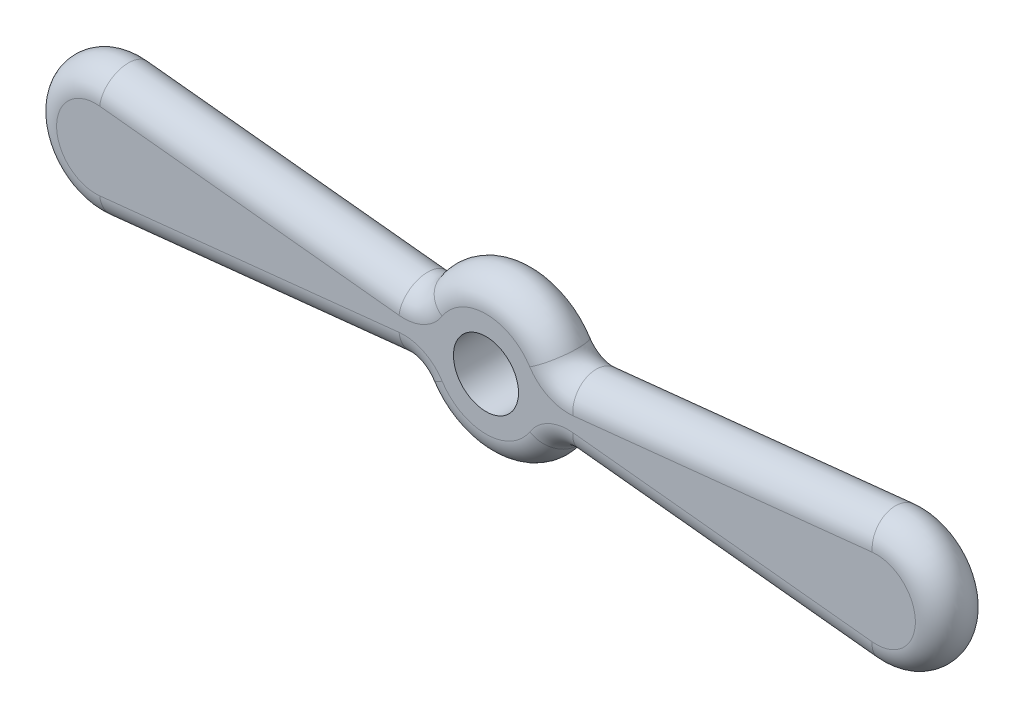
ISO-10303-21;
HEADER;
FILE_DESCRIPTION(('STEP AP214'),'2;1');
FILE_NAME('part.step','',(''),(''),'','','');
FILE_SCHEMA(('AUTOMOTIVE_DESIGN { 1 0 10303 214 1 1 1 1 }'));
ENDSEC;
DATA;
#1=APPLICATION_CONTEXT('core data for automotive mechanical design processes');
#2=APPLICATION_PROTOCOL_DEFINITION('international standard','automotive_design',2000,#1);
#3=PRODUCT_CONTEXT('',#1,'mechanical');
#4=PRODUCT('Part','Part','',(#3));
#5=PRODUCT_RELATED_PRODUCT_CATEGORY('part','',(#4));
#6=PRODUCT_DEFINITION_FORMATION('','',#4);
#7=PRODUCT_DEFINITION_CONTEXT('part definition',#1,'design');
#8=PRODUCT_DEFINITION('design','',#6,#7);
#9=PRODUCT_DEFINITION_SHAPE('','',#8);
#10=(LENGTH_UNIT() NAMED_UNIT(*) SI_UNIT(.MILLI.,.METRE.));
#11=(NAMED_UNIT(*) PLANE_ANGLE_UNIT() SI_UNIT($,.RADIAN.));
#12=(NAMED_UNIT(*) SI_UNIT($,.STERADIAN.) SOLID_ANGLE_UNIT());
#13=UNCERTAINTY_MEASURE_WITH_UNIT(LENGTH_MEASURE(1.E-05),#10,'distance_accuracy_value','');
#14=(GEOMETRIC_REPRESENTATION_CONTEXT(3) GLOBAL_UNCERTAINTY_ASSIGNED_CONTEXT((#13)) GLOBAL_UNIT_ASSIGNED_CONTEXT((#10,
#11,#12)) REPRESENTATION_CONTEXT('',''));
#15=CARTESIAN_POINT('',(0.,0.,0.));
#16=DIRECTION('',(0.,0.,1.));
#17=DIRECTION('',(1.,0.,0.));
#18=AXIS2_PLACEMENT_3D('',#15,#16,#17);
#19=CARTESIAN_POINT('',(-13.3613047546325,1.13112527982777,4.));
#20=DIRECTION('',(-0.994521895368273,0.104528463267654,0.));
#21=DIRECTION('',(-0.104528463267654,-0.994521895368273,0.));
#22=AXIS2_PLACEMENT_3D('',#19,#20,#21);
#23=CYLINDRICAL_SURFACE('',#22,4.);
#24=CARTESIAN_POINT('',(-59.3728292203941,5.96713137220964,4.));
#25=DIRECTION('',(-0.994521895368273,0.104528463267655,0.));
#26=DIRECTION('',(-0.104528463267655,-0.994521895368273,0.));
#27=AXIS2_PLACEMENT_3D('',#24,#25,#26);
#28=CIRCLE('',#27,4.);
#29=CARTESIAN_POINT('',(-59.3728292203941,5.96713137220964,8.));
#30=VERTEX_POINT('',#29);
#31=CARTESIAN_POINT('',(-59.3728292203941,5.96713137220964,0.));
#32=VERTEX_POINT('',#31);
#33=EDGE_CURVE('E11',#30,#32,#28,.T.);
#34=ORIENTED_EDGE('',*,*,#33,.F.);
#35=DIRECTION('',(0.994521895368273,-0.104528463267654,0.));
#36=VECTOR('',#35,1.);
#37=CARTESIAN_POINT('',(-13.3613047546325,1.13112527982777,8.));
#38=LINE('',#37,#36);
#39=CARTESIAN_POINT('',(-13.3613047546325,1.13112527982777,8.));
#40=VERTEX_POINT('',#39);
#41=EDGE_CURVE('E142',#40,#30,#38,.F.);
#42=ORIENTED_EDGE('',*,*,#41,.F.);
#43=CARTESIAN_POINT('',(-13.3613047546325,1.13112527982777,4.));
#44=DIRECTION('',(-0.994521895368273,0.104528463267654,0.));
#45=DIRECTION('',(-0.104528463267654,-0.994521895368273,0.));
#46=AXIS2_PLACEMENT_3D('',#43,#44,#45);
#47=CIRCLE('',#46,4.);
#48=CARTESIAN_POINT('',(-13.3613047546325,1.13112527982777,0.));
#49=VERTEX_POINT('',#48);
#50=EDGE_CURVE('E45',#40,#49,#47,.T.);
#51=ORIENTED_EDGE('',*,*,#50,.T.);
#52=DIRECTION('',(-0.994521895368273,0.104528463267654,0.));
#53=VECTOR('',#52,1.);
#54=CARTESIAN_POINT('',(13.3045023578726,-1.67156398447414,0.));
#55=LINE('',#54,#53);
#56=EDGE_CURVE('E181',#32,#49,#55,.F.);
#57=ORIENTED_EDGE('',*,*,#56,.F.);
#58=EDGE_LOOP('',(#34,#42,#51,#57));
#59=FACE_BOUND('',#58,.T.);
#60=ADVANCED_FACE('F37',(#59),#23,.T.);
#61=CARTESIAN_POINT('',(-12.6296055117589,8.09277854740568,4.));
#62=DIRECTION('',(0.,0.,-1.));
#63=DIRECTION('',(-1.,0.,0.));
#64=AXIS2_PLACEMENT_3D('',#61,#62,#63);
#65=TOROIDAL_SURFACE('',#64,7.,4.);
#66=ORIENTED_EDGE('',*,*,#50,.F.);
#67=CARTESIAN_POINT('',(-12.6296055117589,8.09277854740568,8.));
#68=DIRECTION('',(0.,0.,1.));
#69=DIRECTION('',(1.,0.,0.));
#70=AXIS2_PLACEMENT_3D('',#67,#68,#69);
#71=CIRCLE('',#70,7.);
#72=CARTESIAN_POINT('',(-6.73578960627141,4.31614855861636,8.));
#73=VERTEX_POINT('',#72);
#74=EDGE_CURVE('E128',#73,#40,#71,.F.);
#75=ORIENTED_EDGE('',*,*,#74,.F.);
#76=CARTESIAN_POINT('',(-6.73578960627141,4.31614855861636,4.));
#77=DIRECTION('',(-0.539518569827047,-0.841973700783925,0.));
#78=DIRECTION('',(0.841973700783925,-0.539518569827047,0.));
#79=AXIS2_PLACEMENT_3D('',#76,#77,#78);
#80=CIRCLE('',#79,4.);
#81=CARTESIAN_POINT('',(-6.73578960627141,4.31614855861636,0.));
#82=VERTEX_POINT('',#81);
#83=EDGE_CURVE('E135',#73,#82,#80,.T.);
#84=ORIENTED_EDGE('',*,*,#83,.T.);
#85=CARTESIAN_POINT('',(-12.6296055117589,8.09277854740568,0.));
#86=DIRECTION('',(0.,0.,1.));
#87=DIRECTION('',(1.,0.,0.));
#88=AXIS2_PLACEMENT_3D('',#85,#86,#87);
#89=CIRCLE('',#88,7.);
#90=EDGE_CURVE('E130',#49,#82,#89,.T.);
#91=ORIENTED_EDGE('',*,*,#90,.F.);
#92=EDGE_LOOP('',(#66,#75,#84,#91));
#93=FACE_BOUND('',#92,.T.);
#94=ADVANCED_FACE('F127',(#93),#65,.T.);
#95=CARTESIAN_POINT('',(0.,0.,4.));
#96=DIRECTION('',(0.,0.,1.));
#97=DIRECTION('',(1.,0.,0.));
#98=AXIS2_PLACEMENT_3D('',#95,#96,#97);
#99=TOROIDAL_SURFACE('',#98,8.,4.);
#100=ORIENTED_EDGE('',*,*,#83,.F.);
#101=CARTESIAN_POINT('',(0.,0.,8.));
#102=DIRECTION('',(0.,0.,1.));
#103=DIRECTION('',(1.,0.,0.));
#104=AXIS2_PLACEMENT_3D('',#101,#102,#103);
#105=CIRCLE('',#104,8.);
#106=CARTESIAN_POINT('',(6.73578960627141,4.31614855861636,8.));
#107=VERTEX_POINT('',#106);
#108=EDGE_CURVE('E145',#107,#73,#105,.T.);
#109=ORIENTED_EDGE('',*,*,#108,.F.);
#110=CARTESIAN_POINT('',(6.73578960627141,4.31614855861636,4.));
#111=DIRECTION('',(-0.539518569827046,0.841973700783925,0.));
#112=DIRECTION('',(-0.841973700783926,-0.539518569827046,0.));
#113=AXIS2_PLACEMENT_3D('',#110,#111,#112);
#114=CIRCLE('',#113,4.);
#115=CARTESIAN_POINT('',(6.73578960627141,4.31614855861636,0.));
#116=VERTEX_POINT('',#115);
#117=EDGE_CURVE('E228',#107,#116,#114,.T.);
#118=ORIENTED_EDGE('',*,*,#117,.T.);
#119=CARTESIAN_POINT('',(0.,0.,0.));
#120=DIRECTION('',(0.,0.,1.));
#121=DIRECTION('',(1.,0.,0.));
#122=AXIS2_PLACEMENT_3D('',#119,#120,#121);
#123=CIRCLE('',#122,8.);
#124=EDGE_CURVE('E184',#82,#116,#123,.F.);
#125=ORIENTED_EDGE('',*,*,#124,.F.);
#126=EDGE_LOOP('',(#100,#109,#118,#125));
#127=FACE_BOUND('',#126,.T.);
#128=ADVANCED_FACE('F232',(#127),#99,.T.);
#129=CARTESIAN_POINT('',(12.6296055117589,8.09277854740568,4.));
#130=DIRECTION('',(0.,0.,-1.));
#131=DIRECTION('',(-1.,0.,0.));
#132=AXIS2_PLACEMENT_3D('',#129,#130,#131);
#133=TOROIDAL_SURFACE('',#132,7.,4.);
#134=ORIENTED_EDGE('',*,*,#117,.F.);
#135=CARTESIAN_POINT('',(12.6296055117589,8.09277854740568,8.));
#136=DIRECTION('',(0.,0.,1.));
#137=DIRECTION('',(1.,0.,0.));
#138=AXIS2_PLACEMENT_3D('',#135,#136,#137);
#139=CIRCLE('',#138,7.);
#140=CARTESIAN_POINT('',(13.3613047546325,1.13112527982777,8.));
#141=VERTEX_POINT('',#140);
#142=EDGE_CURVE('E156',#141,#107,#139,.F.);
#143=ORIENTED_EDGE('',*,*,#142,.F.);
#144=CARTESIAN_POINT('',(13.3613047546325,1.13112527982777,4.));
#145=DIRECTION('',(-0.994521895368273,-0.104528463267654,0.));
#146=DIRECTION('',(0.104528463267654,-0.994521895368273,0.));
#147=AXIS2_PLACEMENT_3D('',#144,#145,#146);
#148=CIRCLE('',#147,4.);
#149=CARTESIAN_POINT('',(13.3613047546325,1.13112527982777,0.));
#150=VERTEX_POINT('',#149);
#151=EDGE_CURVE('E226',#141,#150,#148,.T.);
#152=ORIENTED_EDGE('',*,*,#151,.T.);
#153=CARTESIAN_POINT('',(12.6296055117589,8.09277854740568,0.));
#154=DIRECTION('',(0.,0.,1.));
#155=DIRECTION('',(1.,0.,0.));
#156=AXIS2_PLACEMENT_3D('',#153,#154,#155);
#157=CIRCLE('',#156,7.);
#158=EDGE_CURVE('E187',#116,#150,#157,.T.);
#159=ORIENTED_EDGE('',*,*,#158,.F.);
#160=EDGE_LOOP('',(#134,#143,#152,#159));
#161=FACE_BOUND('',#160,.T.);
#162=ADVANCED_FACE('F263',(#161),#133,.T.);
#163=CARTESIAN_POINT('',(59.3728292203941,5.96713137220964,4.));
#164=DIRECTION('',(-0.994521895368273,-0.104528463267654,0.));
#165=DIRECTION('',(0.104528463267654,-0.994521895368273,0.));
#166=AXIS2_PLACEMENT_3D('',#163,#164,#165);
#167=CYLINDRICAL_SURFACE('',#166,4.);
#168=ORIENTED_EDGE('',*,*,#151,.F.);
#169=DIRECTION('',(0.994521895368273,0.104528463267654,0.));
#170=VECTOR('',#169,1.);
#171=CARTESIAN_POINT('',(59.3728292203941,5.96713137220964,8.));
#172=LINE('',#171,#170);
#173=CARTESIAN_POINT('',(59.3728292203941,5.96713137220964,8.));
#174=VERTEX_POINT('',#173);
#175=EDGE_CURVE('E158',#174,#141,#172,.F.);
#176=ORIENTED_EDGE('',*,*,#175,.F.);
#177=CARTESIAN_POINT('',(59.3728292203941,5.96713137220964,4.));
#178=DIRECTION('',(-0.994521895368273,-0.104528463267655,0.));
#179=DIRECTION('',(0.104528463267655,-0.994521895368273,0.));
#180=AXIS2_PLACEMENT_3D('',#177,#178,#179);
#181=CIRCLE('',#180,4.);
#182=CARTESIAN_POINT('',(59.3728292203941,5.96713137220964,0.));
#183=VERTEX_POINT('',#182);
#184=EDGE_CURVE('E224',#174,#183,#181,.T.);
#185=ORIENTED_EDGE('',*,*,#184,.T.);
#186=DIRECTION('',(-0.994521895368273,-0.104528463267654,0.));
#187=VECTOR('',#186,1.);
#188=CARTESIAN_POINT('',(11.6787214834276,0.954278651836967,0.));
#189=LINE('',#188,#187);
#190=EDGE_CURVE('E190',#150,#183,#189,.F.);
#191=ORIENTED_EDGE('',*,*,#190,.F.);
#192=EDGE_LOOP('',(#168,#176,#185,#191));
#193=FACE_BOUND('',#192,.T.);
#194=ADVANCED_FACE('F260',(#193),#167,.T.);
#195=CARTESIAN_POINT('',(60.,0.,4.));
#196=DIRECTION('',(0.,0.,1.));
#197=DIRECTION('',(1.,0.,0.));
#198=AXIS2_PLACEMENT_3D('',#195,#196,#197);
#199=TOROIDAL_SURFACE('',#198,6.,4.);
#200=ORIENTED_EDGE('',*,*,#184,.F.);
#201=CARTESIAN_POINT('',(60.,0.,8.));
#202=DIRECTION('',(0.,0.,1.));
#203=DIRECTION('',(1.,0.,0.));
#204=AXIS2_PLACEMENT_3D('',#201,#202,#203);
#205=CIRCLE('',#204,6.);
#206=CARTESIAN_POINT('',(59.3728292203941,-5.96713137220964,8.));
#207=VERTEX_POINT('',#206);
#208=EDGE_CURVE('E161',#207,#174,#205,.T.);
#209=ORIENTED_EDGE('',*,*,#208,.F.);
#210=CARTESIAN_POINT('',(59.3728292203941,-5.96713137220964,4.));
#211=DIRECTION('',(0.994521895368273,-0.104528463267655,0.));
#212=DIRECTION('',(0.104528463267655,0.994521895368273,0.));
#213=AXIS2_PLACEMENT_3D('',#210,#211,#212);
#214=CIRCLE('',#213,4.);
#215=CARTESIAN_POINT('',(59.3728292203941,-5.96713137220964,0.));
#216=VERTEX_POINT('',#215);
#217=EDGE_CURVE('E222',#207,#216,#214,.T.);
#218=ORIENTED_EDGE('',*,*,#217,.T.);
#219=CARTESIAN_POINT('',(60.,0.,0.));
#220=DIRECTION('',(0.,0.,1.));
#221=DIRECTION('',(1.,0.,0.));
#222=AXIS2_PLACEMENT_3D('',#219,#220,#221);
#223=CIRCLE('',#222,6.);
#224=EDGE_CURVE('E193',#183,#216,#223,.F.);
#225=ORIENTED_EDGE('',*,*,#224,.F.);
#226=EDGE_LOOP('',(#200,#209,#218,#225));
#227=FACE_BOUND('',#226,.T.);
#228=ADVANCED_FACE('F256',(#227),#199,.T.);
#229=CARTESIAN_POINT('',(13.3613047546325,-1.13112527982777,4.));
#230=DIRECTION('',(0.994521895368273,-0.104528463267654,0.));
#231=DIRECTION('',(0.104528463267654,0.994521895368273,0.));
#232=AXIS2_PLACEMENT_3D('',#229,#230,#231);
#233=CYLINDRICAL_SURFACE('',#232,4.);
#234=ORIENTED_EDGE('',*,*,#217,.F.);
#235=DIRECTION('',(-0.994521895368273,0.104528463267654,0.));
#236=VECTOR('',#235,1.);
#237=CARTESIAN_POINT('',(13.3613047546325,-1.13112527982777,8.));
#238=LINE('',#237,#236);
#239=CARTESIAN_POINT('',(13.3613047546325,-1.13112527982777,8.));
#240=VERTEX_POINT('',#239);
#241=EDGE_CURVE('E164',#240,#207,#238,.F.);
#242=ORIENTED_EDGE('',*,*,#241,.F.);
#243=CARTESIAN_POINT('',(13.3613047546325,-1.13112527982777,4.));
#244=DIRECTION('',(0.994521895368273,-0.104528463267654,0.));
#245=DIRECTION('',(0.104528463267654,0.994521895368273,0.));
#246=AXIS2_PLACEMENT_3D('',#243,#244,#245);
#247=CIRCLE('',#246,4.);
#248=CARTESIAN_POINT('',(13.3613047546325,-1.13112527982777,0.));
#249=VERTEX_POINT('',#248);
#250=EDGE_CURVE('E220',#240,#249,#247,.T.);
#251=ORIENTED_EDGE('',*,*,#250,.T.);
#252=DIRECTION('',(0.994521895368273,-0.104528463267654,0.));
#253=VECTOR('',#252,1.);
#254=CARTESIAN_POINT('',(13.3613047546325,-1.13112527982777,0.));
#255=LINE('',#254,#253);
#256=EDGE_CURVE('E196',#216,#249,#255,.F.);
#257=ORIENTED_EDGE('',*,*,#256,.F.);
#258=EDGE_LOOP('',(#234,#242,#251,#257));
#259=FACE_BOUND('',#258,.T.);
#260=ADVANCED_FACE('F252',(#259),#233,.T.);
#261=CARTESIAN_POINT('',(12.6296055117589,-8.09277854740568,4.));
#262=DIRECTION('',(0.,0.,-1.));
#263=DIRECTION('',(-1.,0.,0.));
#264=AXIS2_PLACEMENT_3D('',#261,#262,#263);
#265=TOROIDAL_SURFACE('',#264,7.,4.);
#266=ORIENTED_EDGE('',*,*,#250,.F.);
#267=CARTESIAN_POINT('',(12.6296055117589,-8.09277854740568,8.));
#268=DIRECTION('',(0.,0.,1.));
#269=DIRECTION('',(1.,0.,0.));
#270=AXIS2_PLACEMENT_3D('',#267,#268,#269);
#271=CIRCLE('',#270,7.);
#272=CARTESIAN_POINT('',(6.7357896062714,-4.31614855861637,8.));
#273=VERTEX_POINT('',#272);
#274=EDGE_CURVE('E167',#273,#240,#271,.F.);
#275=ORIENTED_EDGE('',*,*,#274,.F.);
#276=CARTESIAN_POINT('',(6.7357896062714,-4.31614855861637,4.));
#277=DIRECTION('',(0.539518569827046,0.841973700783925,0.));
#278=DIRECTION('',(-0.841973700783925,0.539518569827046,0.));
#279=AXIS2_PLACEMENT_3D('',#276,#277,#278);
#280=CIRCLE('',#279,4.);
#281=CARTESIAN_POINT('',(6.7357896062714,-4.31614855861637,0.));
#282=VERTEX_POINT('',#281);
#283=EDGE_CURVE('E218',#273,#282,#280,.T.);
#284=ORIENTED_EDGE('',*,*,#283,.T.);
#285=CARTESIAN_POINT('',(12.6296055117589,-8.09277854740568,0.));
#286=DIRECTION('',(0.,0.,1.));
#287=DIRECTION('',(1.,0.,0.));
#288=AXIS2_PLACEMENT_3D('',#285,#286,#287);
#289=CIRCLE('',#288,7.);
#290=EDGE_CURVE('E199',#249,#282,#289,.T.);
#291=ORIENTED_EDGE('',*,*,#290,.F.);
#292=EDGE_LOOP('',(#266,#275,#284,#291));
#293=FACE_BOUND('',#292,.T.);
#294=ADVANCED_FACE('F248',(#293),#265,.T.);
#295=CARTESIAN_POINT('',(0.,0.,4.));
#296=DIRECTION('',(0.,0.,1.));
#297=DIRECTION('',(1.,0.,0.));
#298=AXIS2_PLACEMENT_3D('',#295,#296,#297);
#299=TOROIDAL_SURFACE('',#298,8.,4.);
#300=ORIENTED_EDGE('',*,*,#283,.F.);
#301=CARTESIAN_POINT('',(0.,0.,8.));
#302=DIRECTION('',(0.,0.,1.));
#303=DIRECTION('',(1.,0.,0.));
#304=AXIS2_PLACEMENT_3D('',#301,#302,#303);
#305=CIRCLE('',#304,8.);
#306=CARTESIAN_POINT('',(-6.73578960627141,-4.31614855861636,8.));
#307=VERTEX_POINT('',#306);
#308=EDGE_CURVE('E170',#307,#273,#305,.T.);
#309=ORIENTED_EDGE('',*,*,#308,.F.);
#310=CARTESIAN_POINT('',(-6.73578960627141,-4.31614855861636,4.));
#311=DIRECTION('',(0.539518569827046,-0.841973700783925,0.));
#312=DIRECTION('',(0.841973700783926,0.539518569827046,0.));
#313=AXIS2_PLACEMENT_3D('',#310,#311,#312);
#314=CIRCLE('',#313,4.);
#315=CARTESIAN_POINT('',(-6.73578960627141,-4.31614855861636,0.));
#316=VERTEX_POINT('',#315);
#317=EDGE_CURVE('E216',#307,#316,#314,.T.);
#318=ORIENTED_EDGE('',*,*,#317,.T.);
#319=CARTESIAN_POINT('',(0.,0.,0.));
#320=DIRECTION('',(0.,0.,1.));
#321=DIRECTION('',(1.,0.,0.));
#322=AXIS2_PLACEMENT_3D('',#319,#320,#321);
#323=CIRCLE('',#322,8.);
#324=EDGE_CURVE('E202',#282,#316,#323,.F.);
#325=ORIENTED_EDGE('',*,*,#324,.F.);
#326=EDGE_LOOP('',(#300,#309,#318,#325));
#327=FACE_BOUND('',#326,.T.);
#328=ADVANCED_FACE('F245',(#327),#299,.T.);
#329=CARTESIAN_POINT('',(-12.6296055117589,-8.09277854740568,4.));
#330=DIRECTION('',(0.,0.,-1.));
#331=DIRECTION('',(-1.,0.,0.));
#332=AXIS2_PLACEMENT_3D('',#329,#330,#331);
#333=TOROIDAL_SURFACE('',#332,7.,4.);
#334=ORIENTED_EDGE('',*,*,#317,.F.);
#335=CARTESIAN_POINT('',(-12.6296055117589,-8.09277854740568,8.));
#336=DIRECTION('',(0.,0.,1.));
#337=DIRECTION('',(1.,0.,0.));
#338=AXIS2_PLACEMENT_3D('',#335,#336,#337);
#339=CIRCLE('',#338,7.);
#340=CARTESIAN_POINT('',(-13.3613047546325,-1.13112527982777,8.));
#341=VERTEX_POINT('',#340);
#342=EDGE_CURVE('E173',#341,#307,#339,.F.);
#343=ORIENTED_EDGE('',*,*,#342,.F.);
#344=CARTESIAN_POINT('',(-13.3613047546325,-1.13112527982777,4.));
#345=DIRECTION('',(0.994521895368273,0.104528463267655,0.));
#346=DIRECTION('',(-0.104528463267655,0.994521895368273,0.));
#347=AXIS2_PLACEMENT_3D('',#344,#345,#346);
#348=CIRCLE('',#347,4.);
#349=CARTESIAN_POINT('',(-13.3613047546325,-1.13112527982777,0.));
#350=VERTEX_POINT('',#349);
#351=EDGE_CURVE('E60',#341,#350,#348,.T.);
#352=ORIENTED_EDGE('',*,*,#351,.T.);
#353=CARTESIAN_POINT('',(-12.6296055117589,-8.09277854740568,0.));
#354=DIRECTION('',(0.,0.,1.));
#355=DIRECTION('',(1.,0.,0.));
#356=AXIS2_PLACEMENT_3D('',#353,#354,#355);
#357=CIRCLE('',#356,7.);
#358=EDGE_CURVE('E205',#316,#350,#357,.T.);
#359=ORIENTED_EDGE('',*,*,#358,.F.);
#360=EDGE_LOOP('',(#334,#343,#352,#359));
#361=FACE_BOUND('',#360,.T.);
#362=ADVANCED_FACE('F241',(#361),#333,.T.);
#363=CARTESIAN_POINT('',(-59.3728292203941,-5.96713137220964,4.));
#364=DIRECTION('',(0.994521895368273,0.104528463267654,0.));
#365=DIRECTION('',(-0.104528463267654,0.994521895368273,0.));
#366=AXIS2_PLACEMENT_3D('',#363,#364,#365);
#367=CYLINDRICAL_SURFACE('',#366,4.);
#368=ORIENTED_EDGE('',*,*,#351,.F.);
#369=DIRECTION('',(-0.994521895368273,-0.104528463267654,0.));
#370=VECTOR('',#369,1.);
#371=CARTESIAN_POINT('',(-59.3728292203941,-5.96713137220964,8.));
#372=LINE('',#371,#370);
#373=CARTESIAN_POINT('',(-59.3728292203941,-5.96713137220964,8.));
#374=VERTEX_POINT('',#373);
#375=EDGE_CURVE('E176',#374,#341,#372,.F.);
#376=ORIENTED_EDGE('',*,*,#375,.F.);
#377=CARTESIAN_POINT('',(-59.3728292203941,-5.96713137220964,4.));
#378=DIRECTION('',(0.994521895368273,0.104528463267655,0.));
#379=DIRECTION('',(-0.104528463267655,0.994521895368273,0.));
#380=AXIS2_PLACEMENT_3D('',#377,#378,#379);
#381=CIRCLE('',#380,4.);
#382=CARTESIAN_POINT('',(-59.3728292203941,-5.96713137220964,0.));
#383=VERTEX_POINT('',#382);
#384=EDGE_CURVE('E52',#374,#383,#381,.T.);
#385=ORIENTED_EDGE('',*,*,#384,.T.);
#386=DIRECTION('',(0.994521895368273,0.104528463267654,0.));
#387=VECTOR('',#386,1.);
#388=CARTESIAN_POINT('',(11.6219190866678,1.49471735648333,0.));
#389=LINE('',#388,#387);
#390=EDGE_CURVE('E208',#350,#383,#389,.F.);
#391=ORIENTED_EDGE('',*,*,#390,.F.);
#392=EDGE_LOOP('',(#368,#376,#385,#391));
#393=FACE_BOUND('',#392,.T.);
#394=ADVANCED_FACE('F239',(#393),#367,.T.);
#395=CARTESIAN_POINT('',(-60.,0.,4.));
#396=DIRECTION('',(0.,0.,1.));
#397=DIRECTION('',(1.,0.,0.));
#398=AXIS2_PLACEMENT_3D('',#395,#396,#397);
#399=TOROIDAL_SURFACE('',#398,6.,4.);
#400=CARTESIAN_POINT('',(-60.,0.,8.));
#401=DIRECTION('',(0.,0.,1.));
#402=DIRECTION('',(1.,0.,0.));
#403=AXIS2_PLACEMENT_3D('',#400,#401,#402);
#404=CIRCLE('',#403,6.);
#405=EDGE_CURVE('E179',#30,#374,#404,.T.);
#406=ORIENTED_EDGE('',*,*,#405,.F.);
#407=ORIENTED_EDGE('',*,*,#33,.T.);
#408=CARTESIAN_POINT('',(-60.,0.,0.));
#409=DIRECTION('',(0.,0.,1.));
#410=DIRECTION('',(1.,0.,0.));
#411=AXIS2_PLACEMENT_3D('',#408,#409,#410);
#412=CIRCLE('',#411,6.);
#413=EDGE_CURVE('E211',#383,#32,#412,.F.);
#414=ORIENTED_EDGE('',*,*,#413,.F.);
#415=ORIENTED_EDGE('',*,*,#384,.F.);
#416=EDGE_LOOP('',(#406,#407,#414,#415));
#417=FACE_BOUND('',#416,.T.);
#418=ADVANCED_FACE('F238',(#417),#399,.T.);
#419=CARTESIAN_POINT('',(12.6296055117589,-8.09277854740568,8.));
#420=DIRECTION('',(0.,0.,1.));
#421=DIRECTION('',(1.,0.,0.));
#422=AXIS2_PLACEMENT_3D('',#419,#420,#421);
#423=PLANE('',#422);
#424=ORIENTED_EDGE('',*,*,#41,.T.);
#425=ORIENTED_EDGE('',*,*,#405,.T.);
#426=ORIENTED_EDGE('',*,*,#375,.T.);
#427=ORIENTED_EDGE('',*,*,#342,.T.);
#428=ORIENTED_EDGE('',*,*,#308,.T.);
#429=ORIENTED_EDGE('',*,*,#274,.T.);
#430=ORIENTED_EDGE('',*,*,#241,.T.);
#431=ORIENTED_EDGE('',*,*,#208,.T.);
#432=ORIENTED_EDGE('',*,*,#175,.T.);
#433=ORIENTED_EDGE('',*,*,#142,.T.);
#434=ORIENTED_EDGE('',*,*,#108,.T.);
#435=ORIENTED_EDGE('',*,*,#74,.T.);
#436=EDGE_LOOP('',(#424,#425,#426,#427,#428,#429,#430,#431,#432,#433,#434,#435));
#437=FACE_BOUND('',#436,.T.);
#438=CARTESIAN_POINT('',(0.,0.,8.));
#439=DIRECTION('',(0.,0.,1.));
#440=DIRECTION('',(1.,0.,0.));
#441=AXIS2_PLACEMENT_3D('',#438,#439,#440);
#442=CIRCLE('',#441,5.);
#443=CARTESIAN_POINT('',(5.,0.,8.));
#444=VERTEX_POINT('',#443);
#445=EDGE_CURVE('E148',#444,#444,#442,.T.);
#446=ORIENTED_EDGE('',*,*,#445,.F.);
#447=EDGE_LOOP('',(#446));
#448=FACE_BOUND('',#447,.T.);
#449=ADVANCED_FACE('F139',(#437,#448),#423,.T.);
#450=CARTESIAN_POINT('',(12.6296055117589,-8.09277854740568,0.));
#451=DIRECTION('',(0.,0.,1.));
#452=DIRECTION('',(1.,0.,0.));
#453=AXIS2_PLACEMENT_3D('',#450,#451,#452);
#454=PLANE('',#453);
#455=ORIENTED_EDGE('',*,*,#390,.T.);
#456=ORIENTED_EDGE('',*,*,#413,.T.);
#457=ORIENTED_EDGE('',*,*,#56,.T.);
#458=ORIENTED_EDGE('',*,*,#90,.T.);
#459=ORIENTED_EDGE('',*,*,#124,.T.);
#460=ORIENTED_EDGE('',*,*,#158,.T.);
#461=ORIENTED_EDGE('',*,*,#190,.T.);
#462=ORIENTED_EDGE('',*,*,#224,.T.);
#463=ORIENTED_EDGE('',*,*,#256,.T.);
#464=ORIENTED_EDGE('',*,*,#290,.T.);
#465=ORIENTED_EDGE('',*,*,#324,.T.);
#466=ORIENTED_EDGE('',*,*,#358,.T.);
#467=EDGE_LOOP('',(#455,#456,#457,#458,#459,#460,#461,#462,#463,#464,#465,#466));
#468=FACE_BOUND('',#467,.T.);
#469=CARTESIAN_POINT('',(0.,0.,0.));
#470=DIRECTION('',(0.,0.,1.));
#471=DIRECTION('',(1.,0.,0.));
#472=AXIS2_PLACEMENT_3D('',#469,#470,#471);
#473=CIRCLE('',#472,5.);
#474=CARTESIAN_POINT('',(5.,0.,0.));
#475=VERTEX_POINT('',#474);
#476=EDGE_CURVE('E151',#475,#475,#473,.T.);
#477=ORIENTED_EDGE('',*,*,#476,.T.);
#478=EDGE_LOOP('',(#477));
#479=FACE_BOUND('',#478,.T.);
#480=ADVANCED_FACE('F235',(#468,#479),#454,.F.);
#481=CARTESIAN_POINT('',(0.,0.,8.));
#482=DIRECTION('',(0.,0.,-1.));
#483=DIRECTION('',(-1.,0.,0.));
#484=AXIS2_PLACEMENT_3D('',#481,#482,#483);
#485=CYLINDRICAL_SURFACE('',#484,5.);
#486=ORIENTED_EDGE('',*,*,#445,.T.);
#487=EDGE_LOOP('',(#486));
#488=FACE_BOUND('',#487,.T.);
#489=ORIENTED_EDGE('',*,*,#476,.F.);
#490=EDGE_LOOP('',(#489));
#491=FACE_BOUND('',#490,.T.);
#492=ADVANCED_FACE('F322',(#488,#491),#485,.F.);
#493=CLOSED_SHELL('',(#60,#94,#128,#162,#194,#228,#260,#294,#328,#362,#394,#418,#449,#480,#492));
#494=MANIFOLD_SOLID_BREP('B2',#493);
#495=ADVANCED_BREP_SHAPE_REPRESENTATION('',(#18,#494),#14);
#496=SHAPE_DEFINITION_REPRESENTATION(#9,#495);
ENDSEC;
END-ISO-10303-21;
